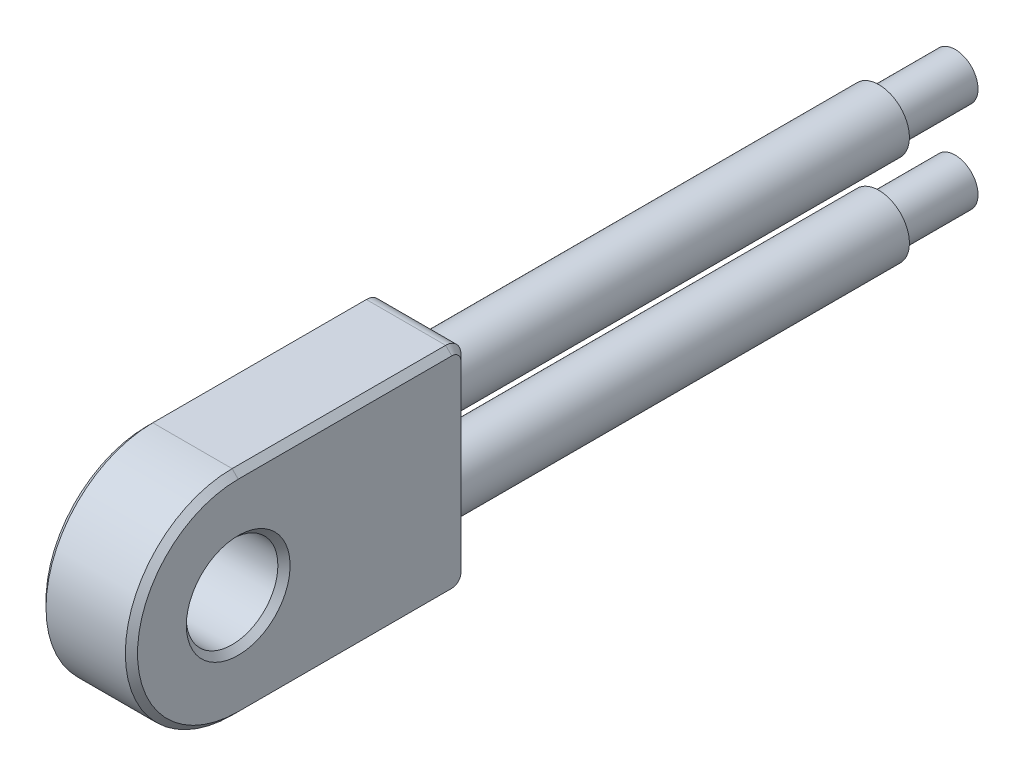
ISO-10303-21;
HEADER;
FILE_DESCRIPTION(('STEP AP214'),'2;1');
FILE_NAME('part.step','',(''),(''),'','','');
FILE_SCHEMA(('AUTOMOTIVE_DESIGN { 1 0 10303 214 1 1 1 1 }'));
ENDSEC;
DATA;
#1=APPLICATION_CONTEXT('core data for automotive mechanical design processes');
#2=APPLICATION_PROTOCOL_DEFINITION('international standard','automotive_design',2000,#1);
#3=PRODUCT_CONTEXT('',#1,'mechanical');
#4=PRODUCT('Part','Part','',(#3));
#5=PRODUCT_RELATED_PRODUCT_CATEGORY('part','',(#4));
#6=PRODUCT_DEFINITION_FORMATION('','',#4);
#7=PRODUCT_DEFINITION_CONTEXT('part definition',#1,'design');
#8=PRODUCT_DEFINITION('design','',#6,#7);
#9=PRODUCT_DEFINITION_SHAPE('','',#8);
#10=(LENGTH_UNIT() NAMED_UNIT(*) SI_UNIT(.MILLI.,.METRE.));
#11=(NAMED_UNIT(*) PLANE_ANGLE_UNIT() SI_UNIT($,.RADIAN.));
#12=(NAMED_UNIT(*) SI_UNIT($,.STERADIAN.) SOLID_ANGLE_UNIT());
#13=UNCERTAINTY_MEASURE_WITH_UNIT(LENGTH_MEASURE(1.E-05),#10,'distance_accuracy_value','');
#14=(GEOMETRIC_REPRESENTATION_CONTEXT(3) GLOBAL_UNCERTAINTY_ASSIGNED_CONTEXT((#13)) GLOBAL_UNIT_ASSIGNED_CONTEXT((#10,
#11,#12)) REPRESENTATION_CONTEXT('',''));
#15=CARTESIAN_POINT('',(0.,0.,0.));
#16=DIRECTION('',(0.,0.,1.));
#17=DIRECTION('',(1.,0.,0.));
#18=AXIS2_PLACEMENT_3D('',#15,#16,#17);
#19=CARTESIAN_POINT('',(3.,3.,-50.));
#20=DIRECTION('',(0.,0.,-1.));
#21=DIRECTION('',(0.,-1.,0.));
#22=AXIS2_PLACEMENT_3D('',#19,#20,#21);
#23=PLANE('',#22);
#24=CARTESIAN_POINT('',(3.,3.,-50.));
#25=DIRECTION('',(0.,0.,-1.));
#26=DIRECTION('',(-1.,0.,0.));
#27=AXIS2_PLACEMENT_3D('',#24,#25,#26);
#28=CIRCLE('',#27,1.5);
#29=CARTESIAN_POINT('',(1.5,3.,-50.));
#30=VERTEX_POINT('',#29);
#31=EDGE_CURVE('E11',#30,#30,#28,.T.);
#32=ORIENTED_EDGE('',*,*,#31,.T.);
#33=EDGE_LOOP('',(#32));
#34=FACE_BOUND('',#33,.T.);
#35=ADVANCED_FACE('F17',(#34),#23,.T.);
#36=CARTESIAN_POINT('',(3.,3.,-50.));
#37=DIRECTION('',(0.,0.,1.));
#38=DIRECTION('',(1.,0.,0.));
#39=AXIS2_PLACEMENT_3D('',#36,#37,#38);
#40=CYLINDRICAL_SURFACE('',#39,1.5);
#41=CARTESIAN_POINT('',(3.,3.,-45.));
#42=DIRECTION('',(0.,0.,-1.));
#43=DIRECTION('',(-1.,0.,0.));
#44=AXIS2_PLACEMENT_3D('',#41,#42,#43);
#45=CIRCLE('',#44,1.5);
#46=CARTESIAN_POINT('',(1.5,3.,-45.));
#47=VERTEX_POINT('',#46);
#48=EDGE_CURVE('E341',#47,#47,#45,.T.);
#49=ORIENTED_EDGE('',*,*,#48,.T.);
#50=DIRECTION('',(0.,0.,-1.));
#51=VECTOR('',#50,1.);
#52=CARTESIAN_POINT('',(1.5,3.,-50.));
#53=LINE('',#52,#51);
#54=EDGE_CURVE('E28',#47,#30,#53,.T.);
#55=ORIENTED_EDGE('',*,*,#54,.T.);
#56=ORIENTED_EDGE('',*,*,#31,.F.);
#57=ORIENTED_EDGE('',*,*,#54,.F.);
#58=EDGE_LOOP('',(#49,#55,#56,#57));
#59=FACE_BOUND('',#58,.T.);
#60=ADVANCED_FACE('F472',(#59),#40,.T.);
#61=CARTESIAN_POINT('',(3.,-3.,-50.));
#62=DIRECTION('',(0.,0.,-1.));
#63=DIRECTION('',(0.,-1.,0.));
#64=AXIS2_PLACEMENT_3D('',#61,#62,#63);
#65=PLANE('',#64);
#66=CARTESIAN_POINT('',(3.,-3.,-50.));
#67=DIRECTION('',(0.,0.,-1.));
#68=DIRECTION('',(-1.,0.,0.));
#69=AXIS2_PLACEMENT_3D('',#66,#67,#68);
#70=CIRCLE('',#69,1.5);
#71=CARTESIAN_POINT('',(1.5,-3.,-50.));
#72=VERTEX_POINT('',#71);
#73=EDGE_CURVE('E299',#72,#72,#70,.T.);
#74=ORIENTED_EDGE('',*,*,#73,.T.);
#75=EDGE_LOOP('',(#74));
#76=FACE_BOUND('',#75,.T.);
#77=ADVANCED_FACE('F477',(#76),#65,.T.);
#78=CARTESIAN_POINT('',(3.,-3.,-50.));
#79=DIRECTION('',(0.,0.,1.));
#80=DIRECTION('',(1.,0.,0.));
#81=AXIS2_PLACEMENT_3D('',#78,#79,#80);
#82=CYLINDRICAL_SURFACE('',#81,1.5);
#83=CARTESIAN_POINT('',(3.,-3.,-45.));
#84=DIRECTION('',(0.,0.,-1.));
#85=DIRECTION('',(-1.,0.,0.));
#86=AXIS2_PLACEMENT_3D('',#83,#84,#85);
#87=CIRCLE('',#86,1.5);
#88=CARTESIAN_POINT('',(1.5,-3.,-45.));
#89=VERTEX_POINT('',#88);
#90=EDGE_CURVE('E209',#89,#89,#87,.T.);
#91=ORIENTED_EDGE('',*,*,#90,.T.);
#92=DIRECTION('',(0.,0.,-1.));
#93=VECTOR('',#92,1.);
#94=CARTESIAN_POINT('',(1.5,-3.,-50.));
#95=LINE('',#94,#93);
#96=EDGE_CURVE('E302',#89,#72,#95,.T.);
#97=ORIENTED_EDGE('',*,*,#96,.T.);
#98=ORIENTED_EDGE('',*,*,#73,.F.);
#99=ORIENTED_EDGE('',*,*,#96,.F.);
#100=EDGE_LOOP('',(#91,#97,#98,#99));
#101=FACE_BOUND('',#100,.T.);
#102=ADVANCED_FACE('F496',(#101),#82,.T.);
#103=CARTESIAN_POINT('',(3.,3.,-45.));
#104=DIRECTION('',(0.,0.,-1.));
#105=DIRECTION('',(0.,-1.,0.));
#106=AXIS2_PLACEMENT_3D('',#103,#104,#105);
#107=PLANE('',#106);
#108=ORIENTED_EDGE('',*,*,#48,.F.);
#109=EDGE_LOOP('',(#108));
#110=FACE_BOUND('',#109,.T.);
#111=CARTESIAN_POINT('',(3.,3.,-45.));
#112=DIRECTION('',(0.,0.,-1.));
#113=DIRECTION('',(-1.,0.,0.));
#114=AXIS2_PLACEMENT_3D('',#111,#112,#113);
#115=CIRCLE('',#114,2.);
#116=CARTESIAN_POINT('',(1.,3.,-45.));
#117=VERTEX_POINT('',#116);
#118=EDGE_CURVE('E273',#117,#117,#115,.T.);
#119=ORIENTED_EDGE('',*,*,#118,.T.);
#120=EDGE_LOOP('',(#119));
#121=FACE_BOUND('',#120,.T.);
#122=ADVANCED_FACE('F487',(#110,#121),#107,.T.);
#123=CARTESIAN_POINT('',(3.,3.,-45.));
#124=DIRECTION('',(0.,0.,1.));
#125=DIRECTION('',(1.,0.,0.));
#126=AXIS2_PLACEMENT_3D('',#123,#124,#125);
#127=CYLINDRICAL_SURFACE('',#126,2.);
#128=CARTESIAN_POINT('',(3.,3.,-15.));
#129=DIRECTION('',(0.,0.,-1.));
#130=DIRECTION('',(-1.,0.,0.));
#131=AXIS2_PLACEMENT_3D('',#128,#129,#130);
#132=CIRCLE('',#131,2.);
#133=CARTESIAN_POINT('',(1.,3.,-15.));
#134=VERTEX_POINT('',#133);
#135=EDGE_CURVE('E226',#134,#134,#132,.T.);
#136=ORIENTED_EDGE('',*,*,#135,.T.);
#137=DIRECTION('',(0.,0.,-1.));
#138=VECTOR('',#137,1.);
#139=CARTESIAN_POINT('',(1.,3.,-45.));
#140=LINE('',#139,#138);
#141=EDGE_CURVE('E269',#134,#117,#140,.T.);
#142=ORIENTED_EDGE('',*,*,#141,.T.);
#143=ORIENTED_EDGE('',*,*,#118,.F.);
#144=ORIENTED_EDGE('',*,*,#141,.F.);
#145=EDGE_LOOP('',(#136,#142,#143,#144));
#146=FACE_BOUND('',#145,.T.);
#147=ADVANCED_FACE('F483',(#146),#127,.T.);
#148=CARTESIAN_POINT('',(3.,-3.,-45.));
#149=DIRECTION('',(0.,0.,-1.));
#150=DIRECTION('',(0.,-1.,0.));
#151=AXIS2_PLACEMENT_3D('',#148,#149,#150);
#152=PLANE('',#151);
#153=ORIENTED_EDGE('',*,*,#90,.F.);
#154=EDGE_LOOP('',(#153));
#155=FACE_BOUND('',#154,.T.);
#156=CARTESIAN_POINT('',(3.,-3.,-45.));
#157=DIRECTION('',(0.,0.,-1.));
#158=DIRECTION('',(-1.,0.,0.));
#159=AXIS2_PLACEMENT_3D('',#156,#157,#158);
#160=CIRCLE('',#159,2.);
#161=CARTESIAN_POINT('',(1.,-3.,-45.));
#162=VERTEX_POINT('',#161);
#163=EDGE_CURVE('E323',#162,#162,#160,.T.);
#164=ORIENTED_EDGE('',*,*,#163,.T.);
#165=EDGE_LOOP('',(#164));
#166=FACE_BOUND('',#165,.T.);
#167=ADVANCED_FACE('F486',(#155,#166),#152,.T.);
#168=CARTESIAN_POINT('',(3.,-3.,-45.));
#169=DIRECTION('',(0.,0.,1.));
#170=DIRECTION('',(1.,0.,0.));
#171=AXIS2_PLACEMENT_3D('',#168,#169,#170);
#172=CYLINDRICAL_SURFACE('',#171,2.);
#173=CARTESIAN_POINT('',(3.,-3.,-15.));
#174=DIRECTION('',(0.,0.,-1.));
#175=DIRECTION('',(-1.,0.,0.));
#176=AXIS2_PLACEMENT_3D('',#173,#174,#175);
#177=CIRCLE('',#176,2.);
#178=CARTESIAN_POINT('',(1.,-3.,-15.));
#179=VERTEX_POINT('',#178);
#180=EDGE_CURVE('E221',#179,#179,#177,.T.);
#181=ORIENTED_EDGE('',*,*,#180,.T.);
#182=DIRECTION('',(0.,0.,-1.));
#183=VECTOR('',#182,1.);
#184=CARTESIAN_POINT('',(1.,-3.,-45.));
#185=LINE('',#184,#183);
#186=EDGE_CURVE('E257',#179,#162,#185,.T.);
#187=ORIENTED_EDGE('',*,*,#186,.T.);
#188=ORIENTED_EDGE('',*,*,#163,.F.);
#189=ORIENTED_EDGE('',*,*,#186,.F.);
#190=EDGE_LOOP('',(#181,#187,#188,#189));
#191=FACE_BOUND('',#190,.T.);
#192=ADVANCED_FACE('F493',(#191),#172,.T.);
#193=CARTESIAN_POINT('',(6.,0.,0.));
#194=DIRECTION('',(-1.,0.,0.));
#195=DIRECTION('',(0.,0.,1.));
#196=AXIS2_PLACEMENT_3D('',#193,#194,#195);
#197=CONICAL_SURFACE('',#196,6.6,0.785398163397452);
#198=DIRECTION('',(-0.707106781186545,0.70710678118655,0.));
#199=VECTOR('',#198,1.);
#200=CARTESIAN_POINT('',(6.,6.6,0.));
#201=LINE('',#200,#199);
#202=CARTESIAN_POINT('',(6.,6.6,0.));
#203=VERTEX_POINT('',#202);
#204=CARTESIAN_POINT('',(5.6,7.,0.));
#205=VERTEX_POINT('',#204);
#206=EDGE_CURVE('E56',#203,#205,#201,.T.);
#207=ORIENTED_EDGE('',*,*,#206,.T.);
#208=CARTESIAN_POINT('',(5.6,0.,0.));
#209=DIRECTION('',(-1.,0.,0.));
#210=DIRECTION('',(0.,0.,-1.));
#211=AXIS2_PLACEMENT_3D('',#208,#209,#210);
#212=CIRCLE('',#211,7.);
#213=CARTESIAN_POINT('',(5.6,-7.,0.));
#214=VERTEX_POINT('',#213);
#215=EDGE_CURVE('E284',#214,#205,#212,.T.);
#216=ORIENTED_EDGE('',*,*,#215,.F.);
#217=DIRECTION('',(0.707106781186545,0.70710678118655,0.));
#218=VECTOR('',#217,1.);
#219=CARTESIAN_POINT('',(5.6,-7.,0.));
#220=LINE('',#219,#218);
#221=CARTESIAN_POINT('',(6.,-6.6,0.));
#222=VERTEX_POINT('',#221);
#223=EDGE_CURVE('E253',#214,#222,#220,.T.);
#224=ORIENTED_EDGE('',*,*,#223,.T.);
#225=CARTESIAN_POINT('',(6.,0.,0.));
#226=DIRECTION('',(1.,0.,0.));
#227=DIRECTION('',(0.,0.,-1.));
#228=AXIS2_PLACEMENT_3D('',#225,#226,#227);
#229=CIRCLE('',#228,6.6);
#230=EDGE_CURVE('E370',#203,#222,#229,.T.);
#231=ORIENTED_EDGE('',*,*,#230,.F.);
#232=EDGE_LOOP('',(#207,#216,#224,#231));
#233=FACE_BOUND('',#232,.T.);
#234=ADVANCED_FACE('F489',(#233),#197,.T.);
#235=CARTESIAN_POINT('',(6.,-6.6,0.));
#236=DIRECTION('',(0.707106781186551,-0.707106781186545,0.));
#237=DIRECTION('',(0.,0.,-1.));
#238=AXIS2_PLACEMENT_3D('',#235,#236,#237);
#239=PLANE('',#238);
#240=DIRECTION('',(0.707106781186545,0.70710678118655,0.));
#241=VECTOR('',#240,1.);
#242=CARTESIAN_POINT('',(5.6,-7.,-14.));
#243=LINE('',#242,#241);
#244=CARTESIAN_POINT('',(5.6,-7.,-14.));
#245=VERTEX_POINT('',#244);
#246=CARTESIAN_POINT('',(6.,-6.6,-14.));
#247=VERTEX_POINT('',#246);
#248=EDGE_CURVE('E241',#245,#247,#243,.T.);
#249=ORIENTED_EDGE('',*,*,#248,.T.);
#250=DIRECTION('',(0.,0.,-1.));
#251=VECTOR('',#250,1.);
#252=CARTESIAN_POINT('',(6.,-6.6,0.));
#253=LINE('',#252,#251);
#254=EDGE_CURVE('E366',#222,#247,#253,.T.);
#255=ORIENTED_EDGE('',*,*,#254,.F.);
#256=ORIENTED_EDGE('',*,*,#223,.F.);
#257=DIRECTION('',(0.,0.,1.));
#258=VECTOR('',#257,1.);
#259=CARTESIAN_POINT('',(5.6,-7.,-14.));
#260=LINE('',#259,#258);
#261=EDGE_CURVE('E310',#245,#214,#260,.T.);
#262=ORIENTED_EDGE('',*,*,#261,.F.);
#263=EDGE_LOOP('',(#249,#255,#256,#262));
#264=FACE_BOUND('',#263,.T.);
#265=ADVANCED_FACE('F492',(#264),#239,.T.);
#266=CARTESIAN_POINT('',(5.6,7.,0.));
#267=DIRECTION('',(-0.707106781186551,-0.707106781186545,0.));
#268=DIRECTION('',(-0.707106781186545,0.707106781186551,0.));
#269=AXIS2_PLACEMENT_3D('',#266,#267,#268);
#270=PLANE('',#269);
#271=DIRECTION('',(-0.707106781186545,0.707106781186551,0.));
#272=VECTOR('',#271,1.);
#273=CARTESIAN_POINT('',(6.,6.6,-14.));
#274=LINE('',#273,#272);
#275=CARTESIAN_POINT('',(6.,6.6,-14.));
#276=VERTEX_POINT('',#275);
#277=CARTESIAN_POINT('',(5.6,7.,-14.));
#278=VERTEX_POINT('',#277);
#279=EDGE_CURVE('E237',#276,#278,#274,.T.);
#280=ORIENTED_EDGE('',*,*,#279,.T.);
#281=DIRECTION('',(0.,0.,-1.));
#282=VECTOR('',#281,1.);
#283=CARTESIAN_POINT('',(5.6,7.,0.));
#284=LINE('',#283,#282);
#285=EDGE_CURVE('E211',#205,#278,#284,.T.);
#286=ORIENTED_EDGE('',*,*,#285,.F.);
#287=ORIENTED_EDGE('',*,*,#206,.F.);
#288=DIRECTION('',(0.,0.,1.));
#289=VECTOR('',#288,1.);
#290=CARTESIAN_POINT('',(6.,6.6,-14.));
#291=LINE('',#290,#289);
#292=EDGE_CURVE('E354',#276,#203,#291,.T.);
#293=ORIENTED_EDGE('',*,*,#292,.F.);
#294=EDGE_LOOP('',(#280,#286,#287,#293));
#295=FACE_BOUND('',#294,.T.);
#296=ADVANCED_FACE('F444',(#295),#270,.F.);
#297=CARTESIAN_POINT('',(6.,-6.,-14.));
#298=DIRECTION('',(-1.,0.,0.));
#299=DIRECTION('',(0.,0.,1.));
#300=AXIS2_PLACEMENT_3D('',#297,#298,#299);
#301=CONICAL_SURFACE('',#300,0.6,0.785398163397452);
#302=DIRECTION('',(0.707106781186545,0.,0.70710678118655));
#303=VECTOR('',#302,1.);
#304=CARTESIAN_POINT('',(5.6,-6.,-15.));
#305=LINE('',#304,#303);
#306=CARTESIAN_POINT('',(5.6,-6.,-15.));
#307=VERTEX_POINT('',#306);
#308=CARTESIAN_POINT('',(6.,-6.,-14.6));
#309=VERTEX_POINT('',#308);
#310=EDGE_CURVE('E305',#307,#309,#305,.T.);
#311=ORIENTED_EDGE('',*,*,#310,.T.);
#312=CARTESIAN_POINT('',(6.,-6.,-14.));
#313=DIRECTION('',(1.,0.,0.));
#314=DIRECTION('',(0.,0.,-1.));
#315=AXIS2_PLACEMENT_3D('',#312,#313,#314);
#316=CIRCLE('',#315,0.6);
#317=EDGE_CURVE('E249',#247,#309,#316,.T.);
#318=ORIENTED_EDGE('',*,*,#317,.F.);
#319=ORIENTED_EDGE('',*,*,#248,.F.);
#320=CARTESIAN_POINT('',(5.6,-6.,-14.));
#321=DIRECTION('',(-1.,0.,0.));
#322=DIRECTION('',(0.,0.,-1.));
#323=AXIS2_PLACEMENT_3D('',#320,#321,#322);
#324=CIRCLE('',#323,1.);
#325=EDGE_CURVE('E289',#307,#245,#324,.T.);
#326=ORIENTED_EDGE('',*,*,#325,.F.);
#327=EDGE_LOOP('',(#311,#318,#319,#326));
#328=FACE_BOUND('',#327,.T.);
#329=ADVANCED_FACE('F522',(#328),#301,.T.);
#330=CARTESIAN_POINT('',(6.,6.,-14.));
#331=DIRECTION('',(-1.,0.,0.));
#332=DIRECTION('',(0.,0.,1.));
#333=AXIS2_PLACEMENT_3D('',#330,#331,#332);
#334=CONICAL_SURFACE('',#333,0.6,0.785398163397452);
#335=DIRECTION('',(-0.707106781186544,0.,-0.707106781186551));
#336=VECTOR('',#335,1.);
#337=CARTESIAN_POINT('',(6.,6.,-14.6));
#338=LINE('',#337,#336);
#339=CARTESIAN_POINT('',(6.,6.,-14.6));
#340=VERTEX_POINT('',#339);
#341=CARTESIAN_POINT('',(5.6,6.,-15.));
#342=VERTEX_POINT('',#341);
#343=EDGE_CURVE('E242',#340,#342,#338,.T.);
#344=ORIENTED_EDGE('',*,*,#343,.T.);
#345=CARTESIAN_POINT('',(5.6,6.,-14.));
#346=DIRECTION('',(-1.,0.,0.));
#347=DIRECTION('',(0.,0.,-1.));
#348=AXIS2_PLACEMENT_3D('',#345,#346,#347);
#349=CIRCLE('',#348,1.);
#350=EDGE_CURVE('E231',#278,#342,#349,.T.);
#351=ORIENTED_EDGE('',*,*,#350,.F.);
#352=ORIENTED_EDGE('',*,*,#279,.F.);
#353=CARTESIAN_POINT('',(6.,6.,-14.));
#354=DIRECTION('',(1.,0.,0.));
#355=DIRECTION('',(0.,0.,-1.));
#356=AXIS2_PLACEMENT_3D('',#353,#354,#355);
#357=CIRCLE('',#356,0.6);
#358=EDGE_CURVE('E205',#340,#276,#357,.T.);
#359=ORIENTED_EDGE('',*,*,#358,.F.);
#360=EDGE_LOOP('',(#344,#351,#352,#359));
#361=FACE_BOUND('',#360,.T.);
#362=ADVANCED_FACE('F450',(#361),#334,.T.);
#363=CARTESIAN_POINT('',(5.6,0.,-15.));
#364=DIRECTION('',(-0.707106781186551,0.,0.707106781186545));
#365=DIRECTION('',(0.,1.,0.));
#366=AXIS2_PLACEMENT_3D('',#363,#364,#365);
#367=PLANE('',#366);
#368=ORIENTED_EDGE('',*,*,#310,.F.);
#369=DIRECTION('',(0.,-1.,0.));
#370=VECTOR('',#369,1.);
#371=CARTESIAN_POINT('',(5.6,6.,-15.));
#372=LINE('',#371,#370);
#373=EDGE_CURVE('E222',#342,#307,#372,.T.);
#374=ORIENTED_EDGE('',*,*,#373,.F.);
#375=ORIENTED_EDGE('',*,*,#343,.F.);
#376=DIRECTION('',(0.,1.,0.));
#377=VECTOR('',#376,1.);
#378=CARTESIAN_POINT('',(6.,-6.,-14.6));
#379=LINE('',#378,#377);
#380=EDGE_CURVE('E245',#309,#340,#379,.T.);
#381=ORIENTED_EDGE('',*,*,#380,.F.);
#382=EDGE_LOOP('',(#368,#374,#375,#381));
#383=FACE_BOUND('',#382,.T.);
#384=ADVANCED_FACE('F461',(#383),#367,.F.);
#385=CARTESIAN_POINT('',(0.,6.,-14.));
#386=DIRECTION('',(1.,0.,0.));
#387=DIRECTION('',(0.,0.,-1.));
#388=AXIS2_PLACEMENT_3D('',#385,#386,#387);
#389=CONICAL_SURFACE('',#388,0.6,0.785398163397448);
#390=DIRECTION('',(0.707106781186548,0.707106781186547,0.));
#391=VECTOR('',#390,1.);
#392=CARTESIAN_POINT('',(0.,6.6,-14.));
#393=LINE('',#392,#391);
#394=CARTESIAN_POINT('',(0.,6.6,-14.));
#395=VERTEX_POINT('',#394);
#396=CARTESIAN_POINT('',(0.4,7.,-14.));
#397=VERTEX_POINT('',#396);
#398=EDGE_CURVE('E191',#395,#397,#393,.T.);
#399=ORIENTED_EDGE('',*,*,#398,.T.);
#400=CARTESIAN_POINT('',(0.4,6.,-14.));
#401=DIRECTION('',(1.,0.,0.));
#402=DIRECTION('',(0.,0.,-1.));
#403=AXIS2_PLACEMENT_3D('',#400,#401,#402);
#404=CIRCLE('',#403,1.);
#405=CARTESIAN_POINT('',(0.4,6.,-15.));
#406=VERTEX_POINT('',#405);
#407=EDGE_CURVE('E236',#406,#397,#404,.T.);
#408=ORIENTED_EDGE('',*,*,#407,.F.);
#409=DIRECTION('',(-0.707106781186545,0.,0.70710678118655));
#410=VECTOR('',#409,1.);
#411=CARTESIAN_POINT('',(0.4,6.,-15.));
#412=LINE('',#411,#410);
#413=CARTESIAN_POINT('',(0.,6.,-14.6));
#414=VERTEX_POINT('',#413);
#415=EDGE_CURVE('E252',#406,#414,#412,.T.);
#416=ORIENTED_EDGE('',*,*,#415,.T.);
#417=CARTESIAN_POINT('',(0.,6.,-14.));
#418=DIRECTION('',(-1.,0.,0.));
#419=DIRECTION('',(0.,0.,-1.));
#420=AXIS2_PLACEMENT_3D('',#417,#418,#419);
#421=CIRCLE('',#420,0.6);
#422=EDGE_CURVE('E194',#395,#414,#421,.T.);
#423=ORIENTED_EDGE('',*,*,#422,.F.);
#424=EDGE_LOOP('',(#399,#408,#416,#423));
#425=FACE_BOUND('',#424,.T.);
#426=ADVANCED_FACE('F459',(#425),#389,.T.);
#427=CARTESIAN_POINT('',(0.,0.,-14.6));
#428=DIRECTION('',(-0.707106781186548,0.,-0.707106781186548));
#429=DIRECTION('',(-0.707106781186548,0.,0.707106781186548));
#430=AXIS2_PLACEMENT_3D('',#427,#428,#429);
#431=PLANE('',#430);
#432=DIRECTION('',(-0.707106781186545,0.,0.70710678118655));
#433=VECTOR('',#432,1.);
#434=CARTESIAN_POINT('',(0.4,-6.,-15.));
#435=LINE('',#434,#433);
#436=CARTESIAN_POINT('',(0.4,-6.,-15.));
#437=VERTEX_POINT('',#436);
#438=CARTESIAN_POINT('',(0.,-6.,-14.6));
#439=VERTEX_POINT('',#438);
#440=EDGE_CURVE('E177',#437,#439,#435,.T.);
#441=ORIENTED_EDGE('',*,*,#440,.T.);
#442=DIRECTION('',(0.,-1.,0.));
#443=VECTOR('',#442,1.);
#444=CARTESIAN_POINT('',(0.,6.,-14.6));
#445=LINE('',#444,#443);
#446=EDGE_CURVE('E202',#414,#439,#445,.T.);
#447=ORIENTED_EDGE('',*,*,#446,.F.);
#448=ORIENTED_EDGE('',*,*,#415,.F.);
#449=DIRECTION('',(0.,1.,0.));
#450=VECTOR('',#449,1.);
#451=CARTESIAN_POINT('',(0.4,-6.,-15.));
#452=LINE('',#451,#450);
#453=EDGE_CURVE('E258',#437,#406,#452,.T.);
#454=ORIENTED_EDGE('',*,*,#453,.F.);
#455=EDGE_LOOP('',(#441,#447,#448,#454));
#456=FACE_BOUND('',#455,.T.);
#457=ADVANCED_FACE('F379',(#456),#431,.T.);
#458=CARTESIAN_POINT('',(0.,6.6,0.));
#459=DIRECTION('',(-0.707106781186548,0.707106781186548,0.));
#460=DIRECTION('',(0.,0.,1.));
#461=AXIS2_PLACEMENT_3D('',#458,#459,#460);
#462=PLANE('',#461);
#463=DIRECTION('',(0.707106781186548,0.707106781186547,0.));
#464=VECTOR('',#463,1.);
#465=CARTESIAN_POINT('',(0.,6.6,0.));
#466=LINE('',#465,#464);
#467=CARTESIAN_POINT('',(0.,6.6,0.));
#468=VERTEX_POINT('',#467);
#469=CARTESIAN_POINT('',(0.4,7.,0.));
#470=VERTEX_POINT('',#469);
#471=EDGE_CURVE('E73',#468,#470,#466,.T.);
#472=ORIENTED_EDGE('',*,*,#471,.T.);
#473=DIRECTION('',(0.,0.,1.));
#474=VECTOR('',#473,1.);
#475=CARTESIAN_POINT('',(0.4,7.,-14.));
#476=LINE('',#475,#474);
#477=EDGE_CURVE('E220',#397,#470,#476,.T.);
#478=ORIENTED_EDGE('',*,*,#477,.F.);
#479=ORIENTED_EDGE('',*,*,#398,.F.);
#480=DIRECTION('',(0.,0.,-1.));
#481=VECTOR('',#480,1.);
#482=CARTESIAN_POINT('',(0.,6.6,0.));
#483=LINE('',#482,#481);
#484=EDGE_CURVE('E184',#468,#395,#483,.T.);
#485=ORIENTED_EDGE('',*,*,#484,.F.);
#486=EDGE_LOOP('',(#472,#478,#479,#485));
#487=FACE_BOUND('',#486,.T.);
#488=ADVANCED_FACE('F190',(#487),#462,.T.);
#489=CARTESIAN_POINT('',(0.,-6.,-14.));
#490=DIRECTION('',(1.,0.,0.));
#491=DIRECTION('',(0.,0.,-1.));
#492=AXIS2_PLACEMENT_3D('',#489,#490,#491);
#493=CONICAL_SURFACE('',#492,0.6,0.785398163397448);
#494=DIRECTION('',(-0.707106781186547,0.707106781186548,0.));
#495=VECTOR('',#494,1.);
#496=CARTESIAN_POINT('',(0.4,-7.,-14.));
#497=LINE('',#496,#495);
#498=CARTESIAN_POINT('',(0.4,-7.,-14.));
#499=VERTEX_POINT('',#498);
#500=CARTESIAN_POINT('',(0.,-6.6,-14.));
#501=VERTEX_POINT('',#500);
#502=EDGE_CURVE('E317',#499,#501,#497,.T.);
#503=ORIENTED_EDGE('',*,*,#502,.T.);
#504=CARTESIAN_POINT('',(0.,-6.,-14.));
#505=DIRECTION('',(-1.,0.,0.));
#506=DIRECTION('',(0.,0.,-1.));
#507=AXIS2_PLACEMENT_3D('',#504,#505,#506);
#508=CIRCLE('',#507,0.6);
#509=EDGE_CURVE('E228',#439,#501,#508,.T.);
#510=ORIENTED_EDGE('',*,*,#509,.F.);
#511=ORIENTED_EDGE('',*,*,#440,.F.);
#512=CARTESIAN_POINT('',(0.4,-6.,-14.));
#513=DIRECTION('',(1.,0.,0.));
#514=DIRECTION('',(0.,0.,-1.));
#515=AXIS2_PLACEMENT_3D('',#512,#513,#514);
#516=CIRCLE('',#515,1.);
#517=EDGE_CURVE('E285',#499,#437,#516,.T.);
#518=ORIENTED_EDGE('',*,*,#517,.F.);
#519=EDGE_LOOP('',(#503,#510,#511,#518));
#520=FACE_BOUND('',#519,.T.);
#521=ADVANCED_FACE('F383',(#520),#493,.T.);
#522=CARTESIAN_POINT('',(0.4,0.,0.));
#523=DIRECTION('',(1.,0.,0.));
#524=DIRECTION('',(0.,0.,1.));
#525=AXIS2_PLACEMENT_3D('',#522,#523,#524);
#526=CONICAL_SURFACE('',#525,7.,0.785398163397448);
#527=DIRECTION('',(0.707106781186548,-0.707106781186547,0.));
#528=VECTOR('',#527,1.);
#529=CARTESIAN_POINT('',(0.,-6.6,0.));
#530=LINE('',#529,#528);
#531=CARTESIAN_POINT('',(0.,-6.6,0.));
#532=VERTEX_POINT('',#531);
#533=CARTESIAN_POINT('',(0.4,-7.,0.));
#534=VERTEX_POINT('',#533);
#535=EDGE_CURVE('E178',#532,#534,#530,.T.);
#536=ORIENTED_EDGE('',*,*,#535,.T.);
#537=CARTESIAN_POINT('',(0.4,0.,0.));
#538=DIRECTION('',(1.,0.,0.));
#539=DIRECTION('',(0.,0.,-1.));
#540=AXIS2_PLACEMENT_3D('',#537,#538,#539);
#541=CIRCLE('',#540,7.);
#542=EDGE_CURVE('E174',#470,#534,#541,.T.);
#543=ORIENTED_EDGE('',*,*,#542,.F.);
#544=ORIENTED_EDGE('',*,*,#471,.F.);
#545=CARTESIAN_POINT('',(0.,0.,0.));
#546=DIRECTION('',(-1.,0.,0.));
#547=DIRECTION('',(0.,0.,-1.));
#548=AXIS2_PLACEMENT_3D('',#545,#546,#547);
#549=CIRCLE('',#548,6.6);
#550=EDGE_CURVE('E171',#532,#468,#549,.T.);
#551=ORIENTED_EDGE('',*,*,#550,.F.);
#552=EDGE_LOOP('',(#536,#543,#544,#551));
#553=FACE_BOUND('',#552,.T.);
#554=ADVANCED_FACE('F170',(#553),#526,.T.);
#555=CARTESIAN_POINT('',(0.4,-7.,0.));
#556=DIRECTION('',(0.707106781186548,0.707106781186548,0.));
#557=DIRECTION('',(0.,0.,-1.));
#558=AXIS2_PLACEMENT_3D('',#555,#556,#557);
#559=PLANE('',#558);
#560=ORIENTED_EDGE('',*,*,#502,.F.);
#561=DIRECTION('',(0.,0.,-1.));
#562=VECTOR('',#561,1.);
#563=CARTESIAN_POINT('',(0.4,-7.,0.));
#564=LINE('',#563,#562);
#565=EDGE_CURVE('E278',#534,#499,#564,.T.);
#566=ORIENTED_EDGE('',*,*,#565,.F.);
#567=ORIENTED_EDGE('',*,*,#535,.F.);
#568=DIRECTION('',(0.,0.,1.));
#569=VECTOR('',#568,1.);
#570=CARTESIAN_POINT('',(0.,-6.6,-14.));
#571=LINE('',#570,#569);
#572=EDGE_CURVE('E21',#501,#532,#571,.T.);
#573=ORIENTED_EDGE('',*,*,#572,.F.);
#574=EDGE_LOOP('',(#560,#566,#567,#573));
#575=FACE_BOUND('',#574,.T.);
#576=ADVANCED_FACE('F532',(#575),#559,.F.);
#577=CARTESIAN_POINT('',(5.6,0.,0.));
#578=DIRECTION('',(1.,0.,0.));
#579=DIRECTION('',(0.,0.,-1.));
#580=AXIS2_PLACEMENT_3D('',#577,#578,#579);
#581=CONICAL_SURFACE('',#580,3.,0.785398163397453);
#582=CARTESIAN_POINT('',(5.6,0.,0.));
#583=DIRECTION('',(1.,0.,0.));
#584=DIRECTION('',(0.,0.,-1.));
#585=AXIS2_PLACEMENT_3D('',#582,#583,#584);
#586=CIRCLE('',#585,3.);
#587=CARTESIAN_POINT('',(5.6,0.,3.));
#588=VERTEX_POINT('',#587);
#589=CARTESIAN_POINT('',(5.6,0.,-3.));
#590=VERTEX_POINT('',#589);
#591=EDGE_CURVE('E279',#588,#590,#586,.T.);
#592=ORIENTED_EDGE('',*,*,#591,.F.);
#593=DIRECTION('',(0.707106781186544,0.,0.707106781186551));
#594=VECTOR('',#593,1.);
#595=CARTESIAN_POINT('',(5.6,0.,3.));
#596=LINE('',#595,#594);
#597=CARTESIAN_POINT('',(6.,0.,3.4));
#598=VERTEX_POINT('',#597);
#599=EDGE_CURVE('E296',#588,#598,#596,.T.);
#600=ORIENTED_EDGE('',*,*,#599,.T.);
#601=CARTESIAN_POINT('',(6.,0.,0.));
#602=DIRECTION('',(-1.,0.,0.));
#603=DIRECTION('',(0.,0.,-1.));
#604=AXIS2_PLACEMENT_3D('',#601,#602,#603);
#605=CIRCLE('',#604,3.4);
#606=EDGE_CURVE('E195',#598,#598,#605,.T.);
#607=ORIENTED_EDGE('',*,*,#606,.F.);
#608=ORIENTED_EDGE('',*,*,#599,.F.);
#609=CARTESIAN_POINT('',(5.6,0.,0.));
#610=DIRECTION('',(1.,0.,0.));
#611=DIRECTION('',(0.,0.,-1.));
#612=AXIS2_PLACEMENT_3D('',#609,#610,#611);
#613=CIRCLE('',#612,3.);
#614=EDGE_CURVE('E315',#590,#588,#613,.T.);
#615=ORIENTED_EDGE('',*,*,#614,.F.);
#616=EDGE_LOOP('',(#592,#600,#607,#608,#615));
#617=FACE_BOUND('',#616,.T.);
#618=ADVANCED_FACE('F434',(#617),#581,.F.);
#619=CARTESIAN_POINT('',(0.,0.,0.));
#620=DIRECTION('',(-1.,0.,0.));
#621=DIRECTION('',(0.,0.,1.));
#622=AXIS2_PLACEMENT_3D('',#619,#620,#621);
#623=CONICAL_SURFACE('',#622,3.4,0.78539816339745);
#624=CARTESIAN_POINT('',(0.4,0.,0.));
#625=DIRECTION('',(-1.,0.,0.));
#626=DIRECTION('',(0.,0.,-1.));
#627=AXIS2_PLACEMENT_3D('',#624,#625,#626);
#628=CIRCLE('',#627,3.);
#629=CARTESIAN_POINT('',(0.4,0.,-3.));
#630=VERTEX_POINT('',#629);
#631=EDGE_CURVE('E311',#630,#630,#628,.T.);
#632=ORIENTED_EDGE('',*,*,#631,.F.);
#633=DIRECTION('',(-0.707106781186546,0.,-0.707106781186549));
#634=VECTOR('',#633,1.);
#635=CARTESIAN_POINT('',(0.,0.,-3.4));
#636=LINE('',#635,#634);
#637=CARTESIAN_POINT('',(0.,0.,-3.4));
#638=VERTEX_POINT('',#637);
#639=EDGE_CURVE('E235',#630,#638,#636,.T.);
#640=ORIENTED_EDGE('',*,*,#639,.T.);
#641=CARTESIAN_POINT('',(0.,0.,0.));
#642=DIRECTION('',(1.,0.,0.));
#643=DIRECTION('',(0.,0.,-1.));
#644=AXIS2_PLACEMENT_3D('',#641,#642,#643);
#645=CIRCLE('',#644,3.4);
#646=EDGE_CURVE('E188',#638,#638,#645,.T.);
#647=ORIENTED_EDGE('',*,*,#646,.F.);
#648=ORIENTED_EDGE('',*,*,#639,.F.);
#649=EDGE_LOOP('',(#632,#640,#647,#648));
#650=FACE_BOUND('',#649,.T.);
#651=ADVANCED_FACE('F498',(#650),#623,.F.);
#652=CARTESIAN_POINT('',(6.,6.,-14.));
#653=DIRECTION('',(-1.,0.,0.));
#654=DIRECTION('',(0.,0.,1.));
#655=AXIS2_PLACEMENT_3D('',#652,#653,#654);
#656=CYLINDRICAL_SURFACE('',#655,1.);
#657=DIRECTION('',(1.,0.,0.));
#658=VECTOR('',#657,1.);
#659=CARTESIAN_POINT('',(5.6,6.,-15.));
#660=LINE('',#659,#658);
#661=EDGE_CURVE('E227',#406,#342,#660,.T.);
#662=ORIENTED_EDGE('',*,*,#661,.F.);
#663=ORIENTED_EDGE('',*,*,#407,.T.);
#664=DIRECTION('',(-1.,0.,0.));
#665=VECTOR('',#664,1.);
#666=CARTESIAN_POINT('',(5.6,7.,-14.));
#667=LINE('',#666,#665);
#668=EDGE_CURVE('E216',#278,#397,#667,.T.);
#669=ORIENTED_EDGE('',*,*,#668,.F.);
#670=ORIENTED_EDGE('',*,*,#350,.T.);
#671=EDGE_LOOP('',(#662,#663,#669,#670));
#672=FACE_BOUND('',#671,.T.);
#673=ADVANCED_FACE('F458',(#672),#656,.T.);
#674=CARTESIAN_POINT('',(6.,-6.,-14.));
#675=DIRECTION('',(1.,0.,0.));
#676=DIRECTION('',(0.,0.,-1.));
#677=AXIS2_PLACEMENT_3D('',#674,#675,#676);
#678=CYLINDRICAL_SURFACE('',#677,1.);
#679=DIRECTION('',(1.,0.,0.));
#680=VECTOR('',#679,1.);
#681=CARTESIAN_POINT('',(5.6,-7.,-14.));
#682=LINE('',#681,#680);
#683=EDGE_CURVE('E306',#499,#245,#682,.T.);
#684=ORIENTED_EDGE('',*,*,#683,.F.);
#685=ORIENTED_EDGE('',*,*,#517,.T.);
#686=DIRECTION('',(-1.,0.,0.));
#687=VECTOR('',#686,1.);
#688=CARTESIAN_POINT('',(5.6,-6.,-15.));
#689=LINE('',#688,#687);
#690=EDGE_CURVE('E262',#307,#437,#689,.T.);
#691=ORIENTED_EDGE('',*,*,#690,.F.);
#692=ORIENTED_EDGE('',*,*,#325,.T.);
#693=EDGE_LOOP('',(#684,#685,#691,#692));
#694=FACE_BOUND('',#693,.T.);
#695=ADVANCED_FACE('F511',(#694),#678,.T.);
#696=CARTESIAN_POINT('',(0.,0.,0.));
#697=DIRECTION('',(1.,0.,0.));
#698=DIRECTION('',(0.,1.,0.));
#699=AXIS2_PLACEMENT_3D('',#696,#697,#698);
#700=PLANE('',#699);
#701=ORIENTED_EDGE('',*,*,#646,.T.);
#702=EDGE_LOOP('',(#701));
#703=FACE_BOUND('',#702,.T.);
#704=ORIENTED_EDGE('',*,*,#484,.T.);
#705=ORIENTED_EDGE('',*,*,#422,.T.);
#706=ORIENTED_EDGE('',*,*,#446,.T.);
#707=ORIENTED_EDGE('',*,*,#509,.T.);
#708=ORIENTED_EDGE('',*,*,#572,.T.);
#709=ORIENTED_EDGE('',*,*,#550,.T.);
#710=EDGE_LOOP('',(#704,#705,#706,#707,#708,#709));
#711=FACE_BOUND('',#710,.T.);
#712=ADVANCED_FACE('F182',(#703,#711),#700,.F.);
#713=CARTESIAN_POINT('',(6.,0.,0.));
#714=DIRECTION('',(1.,0.,0.));
#715=DIRECTION('',(0.,1.,0.));
#716=AXIS2_PLACEMENT_3D('',#713,#714,#715);
#717=PLANE('',#716);
#718=ORIENTED_EDGE('',*,*,#606,.T.);
#719=EDGE_LOOP('',(#718));
#720=FACE_BOUND('',#719,.T.);
#721=ORIENTED_EDGE('',*,*,#292,.T.);
#722=ORIENTED_EDGE('',*,*,#230,.T.);
#723=ORIENTED_EDGE('',*,*,#254,.T.);
#724=ORIENTED_EDGE('',*,*,#317,.T.);
#725=ORIENTED_EDGE('',*,*,#380,.T.);
#726=ORIENTED_EDGE('',*,*,#358,.T.);
#727=EDGE_LOOP('',(#721,#722,#723,#724,#725,#726));
#728=FACE_BOUND('',#727,.T.);
#729=ADVANCED_FACE('F437',(#720,#728),#717,.T.);
#730=CARTESIAN_POINT('',(6.,0.,0.));
#731=DIRECTION('',(-1.,0.,0.));
#732=DIRECTION('',(0.,0.,1.));
#733=AXIS2_PLACEMENT_3D('',#730,#731,#732);
#734=CYLINDRICAL_SURFACE('',#733,3.);
#735=ORIENTED_EDGE('',*,*,#591,.T.);
#736=DIRECTION('',(-1.,0.,0.));
#737=VECTOR('',#736,1.);
#738=CARTESIAN_POINT('',(6.,0.,-3.));
#739=LINE('',#738,#737);
#740=EDGE_CURVE('E283',#590,#630,#739,.T.);
#741=ORIENTED_EDGE('',*,*,#740,.T.);
#742=ORIENTED_EDGE('',*,*,#631,.T.);
#743=ORIENTED_EDGE('',*,*,#740,.F.);
#744=ORIENTED_EDGE('',*,*,#614,.T.);
#745=EDGE_LOOP('',(#735,#741,#742,#743,#744));
#746=FACE_BOUND('',#745,.T.);
#747=ADVANCED_FACE('F427',(#746),#734,.F.);
#748=CARTESIAN_POINT('',(6.,0.,0.));
#749=DIRECTION('',(-1.,0.,0.));
#750=DIRECTION('',(0.,0.,1.));
#751=AXIS2_PLACEMENT_3D('',#748,#749,#750);
#752=CYLINDRICAL_SURFACE('',#751,7.);
#753=DIRECTION('',(-1.,0.,0.));
#754=VECTOR('',#753,1.);
#755=CARTESIAN_POINT('',(5.6,7.,0.));
#756=LINE('',#755,#754);
#757=EDGE_CURVE('E215',#205,#470,#756,.T.);
#758=ORIENTED_EDGE('',*,*,#757,.T.);
#759=ORIENTED_EDGE('',*,*,#542,.T.);
#760=DIRECTION('',(-1.,0.,0.));
#761=VECTOR('',#760,1.);
#762=CARTESIAN_POINT('',(5.6,-7.,0.));
#763=LINE('',#762,#761);
#764=EDGE_CURVE('E274',#214,#534,#763,.T.);
#765=ORIENTED_EDGE('',*,*,#764,.F.);
#766=ORIENTED_EDGE('',*,*,#215,.T.);
#767=EDGE_LOOP('',(#758,#759,#765,#766));
#768=FACE_BOUND('',#767,.T.);
#769=ADVANCED_FACE('F506',(#768),#752,.T.);
#770=CARTESIAN_POINT('',(6.,7.,0.));
#771=DIRECTION('',(0.,1.,0.));
#772=DIRECTION('',(1.,0.,0.));
#773=AXIS2_PLACEMENT_3D('',#770,#771,#772);
#774=PLANE('',#773);
#775=ORIENTED_EDGE('',*,*,#668,.T.);
#776=ORIENTED_EDGE('',*,*,#477,.T.);
#777=ORIENTED_EDGE('',*,*,#757,.F.);
#778=ORIENTED_EDGE('',*,*,#285,.T.);
#779=EDGE_LOOP('',(#775,#776,#777,#778));
#780=FACE_BOUND('',#779,.T.);
#781=ADVANCED_FACE('F457',(#780),#774,.T.);
#782=CARTESIAN_POINT('',(6.,0.,-15.));
#783=DIRECTION('',(0.,0.,-1.));
#784=DIRECTION('',(0.,-1.,0.));
#785=AXIS2_PLACEMENT_3D('',#782,#783,#784);
#786=PLANE('',#785);
#787=ORIENTED_EDGE('',*,*,#180,.F.);
#788=EDGE_LOOP('',(#787));
#789=FACE_BOUND('',#788,.T.);
#790=ORIENTED_EDGE('',*,*,#135,.F.);
#791=EDGE_LOOP('',(#790));
#792=FACE_BOUND('',#791,.T.);
#793=ORIENTED_EDGE('',*,*,#690,.T.);
#794=ORIENTED_EDGE('',*,*,#453,.T.);
#795=ORIENTED_EDGE('',*,*,#661,.T.);
#796=ORIENTED_EDGE('',*,*,#373,.T.);
#797=EDGE_LOOP('',(#793,#794,#795,#796));
#798=FACE_BOUND('',#797,.T.);
#799=ADVANCED_FACE('F505',(#789,#792,#798),#786,.T.);
#800=CARTESIAN_POINT('',(6.,-7.,0.));
#801=DIRECTION('',(0.,1.,0.));
#802=DIRECTION('',(1.,0.,0.));
#803=AXIS2_PLACEMENT_3D('',#800,#801,#802);
#804=PLANE('',#803);
#805=ORIENTED_EDGE('',*,*,#764,.T.);
#806=ORIENTED_EDGE('',*,*,#565,.T.);
#807=ORIENTED_EDGE('',*,*,#683,.T.);
#808=ORIENTED_EDGE('',*,*,#261,.T.);
#809=EDGE_LOOP('',(#805,#806,#807,#808));
#810=FACE_BOUND('',#809,.T.);
#811=ADVANCED_FACE('F19',(#810),#804,.F.);
#812=CLOSED_SHELL('',(#35,#60,#77,#102,#122,#147,#167,#192,#234,#265,#296,#329,#362,#384,#426,
#457,#488,#521,#554,#576,#618,#651,#673,#695,#712,#729,#747,#769,#781,#799,#811));
#813=MANIFOLD_SOLID_BREP('B1',#812);
#814=ADVANCED_BREP_SHAPE_REPRESENTATION('',(#18,#813),#14);
#815=SHAPE_DEFINITION_REPRESENTATION(#9,#814);
ENDSEC;
END-ISO-10303-21;
